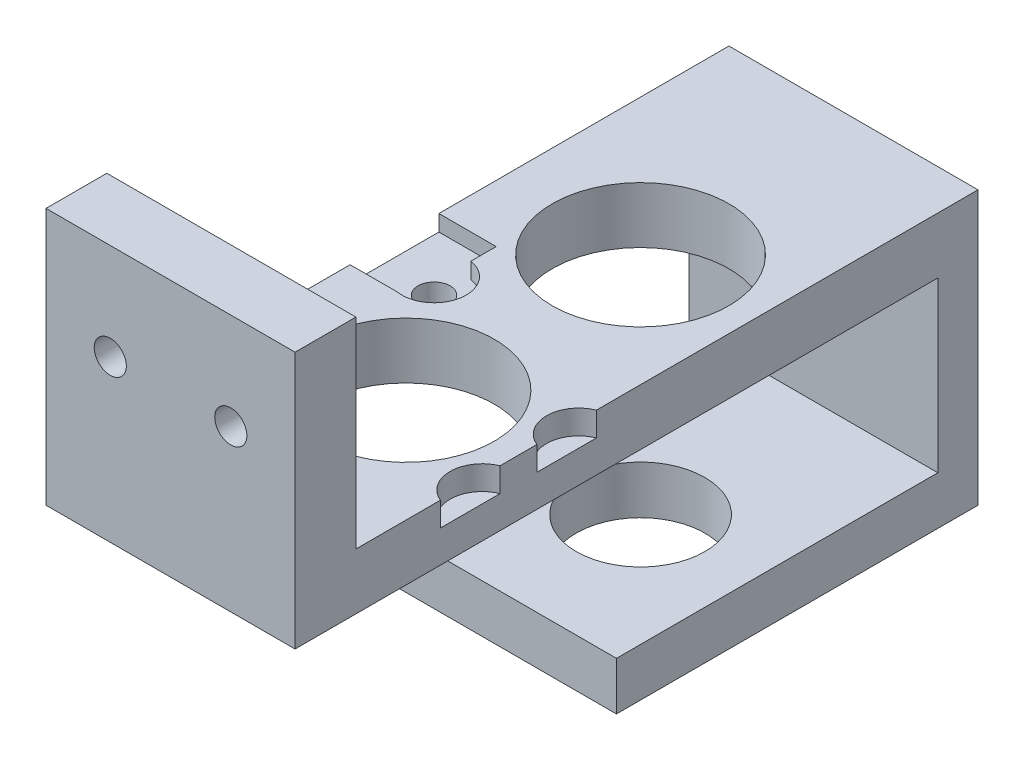
ISO-10303-21;
HEADER;
FILE_DESCRIPTION(('STEP AP214'),'2;1');
FILE_NAME('part.step','',(''),(''),'','','');
FILE_SCHEMA(('AUTOMOTIVE_DESIGN { 1 0 10303 214 1 1 1 1 }'));
ENDSEC;
DATA;
#1=APPLICATION_CONTEXT('core data for automotive mechanical design processes');
#2=APPLICATION_PROTOCOL_DEFINITION('international standard','automotive_design',2000,#1);
#3=PRODUCT_CONTEXT('',#1,'mechanical');
#4=PRODUCT('Part','Part','',(#3));
#5=PRODUCT_RELATED_PRODUCT_CATEGORY('part','',(#4));
#6=PRODUCT_DEFINITION_FORMATION('','',#4);
#7=PRODUCT_DEFINITION_CONTEXT('part definition',#1,'design');
#8=PRODUCT_DEFINITION('design','',#6,#7);
#9=PRODUCT_DEFINITION_SHAPE('','',#8);
#10=(LENGTH_UNIT() NAMED_UNIT(*) SI_UNIT(.MILLI.,.METRE.));
#11=(NAMED_UNIT(*) PLANE_ANGLE_UNIT() SI_UNIT($,.RADIAN.));
#12=(NAMED_UNIT(*) SI_UNIT($,.STERADIAN.) SOLID_ANGLE_UNIT());
#13=UNCERTAINTY_MEASURE_WITH_UNIT(LENGTH_MEASURE(1.E-05),#10,'distance_accuracy_value','');
#14=(GEOMETRIC_REPRESENTATION_CONTEXT(3) GLOBAL_UNCERTAINTY_ASSIGNED_CONTEXT((#13)) GLOBAL_UNIT_ASSIGNED_CONTEXT((#10,
#11,#12)) REPRESENTATION_CONTEXT('',''));
#15=CARTESIAN_POINT('',(0.,0.,0.));
#16=DIRECTION('',(0.,0.,1.));
#17=DIRECTION('',(1.,0.,0.));
#18=AXIS2_PLACEMENT_3D('',#15,#16,#17);
#19=CARTESIAN_POINT('',(-43.661943319838,-7.,42.4348178137652));
#20=DIRECTION('',(0.,1.,0.));
#21=DIRECTION('',(0.,0.,1.));
#22=AXIS2_PLACEMENT_3D('',#19,#20,#21);
#23=CYLINDRICAL_SURFACE('',#22,2.);
#24=CARTESIAN_POINT('',(-43.661943319838,0.,42.4348178137652));
#25=DIRECTION('',(0.,1.,0.));
#26=DIRECTION('',(0.,0.,1.));
#27=AXIS2_PLACEMENT_3D('',#24,#25,#26);
#28=CIRCLE('',#27,2.);
#29=CARTESIAN_POINT('',(-43.661943319838,0.,44.4348178137652));
#30=VERTEX_POINT('',#29);
#31=EDGE_CURVE('E312',#30,#30,#28,.T.);
#32=ORIENTED_EDGE('',*,*,#31,.F.);
#33=EDGE_LOOP('',(#32));
#34=FACE_BOUND('',#33,.T.);
#35=CARTESIAN_POINT('',(-43.661943319838,5.,42.4348178137652));
#36=DIRECTION('',(0.,1.,0.));
#37=DIRECTION('',(0.,0.,1.));
#38=AXIS2_PLACEMENT_3D('',#35,#36,#37);
#39=CIRCLE('',#38,2.);
#40=CARTESIAN_POINT('',(-43.661943319838,5.,44.4348178137652));
#41=VERTEX_POINT('',#40);
#42=EDGE_CURVE('E390',#41,#41,#39,.F.);
#43=ORIENTED_EDGE('',*,*,#42,.F.);
#44=EDGE_LOOP('',(#43));
#45=FACE_BOUND('',#44,.T.);
#46=ADVANCED_FACE('F32',(#34,#45),#23,.F.);
#47=CARTESIAN_POINT('',(-43.661943319838,-7.,14.4348178137652));
#48=DIRECTION('',(0.,1.,0.));
#49=DIRECTION('',(0.,0.,1.));
#50=AXIS2_PLACEMENT_3D('',#47,#48,#49);
#51=CYLINDRICAL_SURFACE('',#50,2.);
#52=CARTESIAN_POINT('',(-43.661943319838,0.,14.4348178137652));
#53=DIRECTION('',(0.,1.,0.));
#54=DIRECTION('',(0.,0.,1.));
#55=AXIS2_PLACEMENT_3D('',#52,#53,#54);
#56=CIRCLE('',#55,2.);
#57=CARTESIAN_POINT('',(-43.661943319838,0.,16.4348178137652));
#58=VERTEX_POINT('',#57);
#59=EDGE_CURVE('E320',#58,#58,#56,.T.);
#60=ORIENTED_EDGE('',*,*,#59,.F.);
#61=EDGE_LOOP('',(#60));
#62=FACE_BOUND('',#61,.T.);
#63=CARTESIAN_POINT('',(-43.661943319838,5.,14.4348178137652));
#64=DIRECTION('',(0.,1.,0.));
#65=DIRECTION('',(0.,0.,1.));
#66=AXIS2_PLACEMENT_3D('',#63,#64,#65);
#67=CIRCLE('',#66,2.);
#68=CARTESIAN_POINT('',(-43.661943319838,5.,16.4348178137652));
#69=VERTEX_POINT('',#68);
#70=EDGE_CURVE('E267',#69,#69,#67,.F.);
#71=ORIENTED_EDGE('',*,*,#70,.F.);
#72=EDGE_LOOP('',(#71));
#73=FACE_BOUND('',#72,.T.);
#74=ADVANCED_FACE('F472',(#62,#73),#51,.F.);
#75=CARTESIAN_POINT('',(-50.161943319838,-27.,-23.7651821862348));
#76=DIRECTION('',(0.,0.,-1.));
#77=DIRECTION('',(-1.,0.,0.));
#78=AXIS2_PLACEMENT_3D('',#75,#76,#77);
#79=PLANE('',#78);
#80=DIRECTION('',(-1.,0.,0.));
#81=VECTOR('',#80,1.);
#82=CARTESIAN_POINT('',(-50.161943319838,-21.,-23.7651821862348));
#83=LINE('',#82,#81);
#84=CARTESIAN_POINT('',(-19.161943319838,-21.,-23.7651821862348));
#85=VERTEX_POINT('',#84);
#86=CARTESIAN_POINT('',(-50.161943319838,-21.,-23.7651821862348));
#87=VERTEX_POINT('',#86);
#88=EDGE_CURVE('E279',#85,#87,#83,.T.);
#89=ORIENTED_EDGE('',*,*,#88,.F.);
#90=DIRECTION('',(0.,1.,0.));
#91=VECTOR('',#90,1.);
#92=CARTESIAN_POINT('',(-19.161943319838,-27.,-23.7651821862348));
#93=LINE('',#92,#91);
#94=CARTESIAN_POINT('',(-19.161943319838,0.,-23.7651821862348));
#95=VERTEX_POINT('',#94);
#96=EDGE_CURVE('E310',#85,#95,#93,.T.);
#97=ORIENTED_EDGE('',*,*,#96,.T.);
#98=DIRECTION('',(-1.,0.,0.));
#99=VECTOR('',#98,1.);
#100=CARTESIAN_POINT('',(-50.161943319838,0.,-23.7651821862348));
#101=LINE('',#100,#99);
#102=CARTESIAN_POINT('',(-50.161943319838,0.,-23.7651821862348));
#103=VERTEX_POINT('',#102);
#104=EDGE_CURVE('E297',#95,#103,#101,.T.);
#105=ORIENTED_EDGE('',*,*,#104,.T.);
#106=DIRECTION('',(0.,1.,0.));
#107=VECTOR('',#106,1.);
#108=CARTESIAN_POINT('',(-50.161943319838,-27.,-23.7651821862348));
#109=LINE('',#108,#107);
#110=EDGE_CURVE('E306',#87,#103,#109,.T.);
#111=ORIENTED_EDGE('',*,*,#110,.F.);
#112=EDGE_LOOP('',(#89,#97,#105,#111));
#113=FACE_BOUND('',#112,.T.);
#114=ADVANCED_FACE('F478',(#113),#79,.F.);
#115=CARTESIAN_POINT('',(0.,0.,0.));
#116=DIRECTION('',(0.,1.,0.));
#117=DIRECTION('',(0.,0.,1.));
#118=AXIS2_PLACEMENT_3D('',#115,#116,#117);
#119=PLANE('',#118);
#120=CARTESIAN_POINT('',(-33.161943319838,0.,-0.765182186234808));
#121=DIRECTION('',(0.,1.,0.));
#122=DIRECTION('',(0.,0.,1.));
#123=AXIS2_PLACEMENT_3D('',#120,#121,#122);
#124=CIRCLE('',#123,11.);
#125=CARTESIAN_POINT('',(-33.161943319838,0.,10.2348178137652));
#126=VERTEX_POINT('',#125);
#127=EDGE_CURVE('E353',#126,#126,#124,.T.);
#128=ORIENTED_EDGE('',*,*,#127,.T.);
#129=EDGE_LOOP('',(#128));
#130=FACE_BOUND('',#129,.T.);
#131=CARTESIAN_POINT('',(-33.161943319838,0.,28.4348178137652));
#132=DIRECTION('',(0.,1.,0.));
#133=DIRECTION('',(0.,0.,1.));
#134=AXIS2_PLACEMENT_3D('',#131,#132,#133);
#135=CIRCLE('',#134,11.);
#136=CARTESIAN_POINT('',(-33.161943319838,0.,39.4348178137652));
#137=VERTEX_POINT('',#136);
#138=EDGE_CURVE('E345',#137,#137,#135,.T.);
#139=ORIENTED_EDGE('',*,*,#138,.T.);
#140=EDGE_LOOP('',(#139));
#141=FACE_BOUND('',#140,.T.);
#142=ORIENTED_EDGE('',*,*,#31,.T.);
#143=EDGE_LOOP('',(#142));
#144=FACE_BOUND('',#143,.T.);
#145=ORIENTED_EDGE('',*,*,#59,.T.);
#146=EDGE_LOOP('',(#145));
#147=FACE_BOUND('',#146,.T.);
#148=ORIENTED_EDGE('',*,*,#104,.F.);
#149=DIRECTION('',(0.,0.,-1.));
#150=VECTOR('',#149,1.);
#151=CARTESIAN_POINT('',(-19.161943319838,0.,-28.7651821862348));
#152=LINE('',#151,#150);
#153=CARTESIAN_POINT('',(-19.161943319838,0.,56.2348178137652));
#154=VERTEX_POINT('',#153);
#155=EDGE_CURVE('E369',#154,#95,#152,.T.);
#156=ORIENTED_EDGE('',*,*,#155,.F.);
#157=DIRECTION('',(1.,0.,0.));
#158=VECTOR('',#157,1.);
#159=CARTESIAN_POINT('',(-50.161943319838,0.,56.2348178137652));
#160=LINE('',#159,#158);
#161=CARTESIAN_POINT('',(-50.161943319838,0.,56.2348178137652));
#162=VERTEX_POINT('',#161);
#163=EDGE_CURVE('E367',#162,#154,#160,.T.);
#164=ORIENTED_EDGE('',*,*,#163,.F.);
#165=DIRECTION('',(0.,0.,1.));
#166=VECTOR('',#165,1.);
#167=CARTESIAN_POINT('',(-50.161943319838,0.,-28.7651821862348));
#168=LINE('',#167,#166);
#169=EDGE_CURVE('E365',#103,#162,#168,.T.);
#170=ORIENTED_EDGE('',*,*,#169,.F.);
#171=EDGE_LOOP('',(#148,#156,#164,#170));
#172=FACE_BOUND('',#171,.T.);
#173=ADVANCED_FACE('F511',(#130,#141,#144,#147,#172),#119,.F.);
#174=CARTESIAN_POINT('',(-50.161943319838,7.,-28.7651821862348));
#175=DIRECTION('',(1.,0.,0.));
#176=DIRECTION('',(0.,0.,-1.));
#177=AXIS2_PLACEMENT_3D('',#174,#175,#176);
#178=PLANE('',#177);
#179=DIRECTION('',(0.,0.,1.));
#180=VECTOR('',#179,1.);
#181=CARTESIAN_POINT('',(-50.161943319838,5.,7.33734720860468));
#182=LINE('',#181,#180);
#183=CARTESIAN_POINT('',(-50.161943319838,5.,7.33734720860468));
#184=VERTEX_POINT('',#183);
#185=CARTESIAN_POINT('',(-50.161943319838,5.,18.3845425666295));
#186=VERTEX_POINT('',#185);
#187=EDGE_CURVE('E219',#184,#186,#182,.T.);
#188=ORIENTED_EDGE('',*,*,#187,.F.);
#189=DIRECTION('',(0.,1.,0.));
#190=VECTOR('',#189,1.);
#191=CARTESIAN_POINT('',(-50.161943319838,5.,7.33734720860468));
#192=LINE('',#191,#190);
#193=CARTESIAN_POINT('',(-50.161943319838,7.,7.33734720860468));
#194=VERTEX_POINT('',#193);
#195=EDGE_CURVE('E239',#184,#194,#192,.T.);
#196=ORIENTED_EDGE('',*,*,#195,.T.);
#197=DIRECTION('',(0.,0.,1.));
#198=VECTOR('',#197,1.);
#199=CARTESIAN_POINT('',(-50.161943319838,7.,-28.7651821862348));
#200=LINE('',#199,#198);
#201=CARTESIAN_POINT('',(-50.161943319838,7.,-28.7651821862348));
#202=VERTEX_POINT('',#201);
#203=EDGE_CURVE('E354',#202,#194,#200,.T.);
#204=ORIENTED_EDGE('',*,*,#203,.F.);
#205=DIRECTION('',(0.,-1.,0.));
#206=VECTOR('',#205,1.);
#207=CARTESIAN_POINT('',(-50.161943319838,7.,-28.7651821862348));
#208=LINE('',#207,#206);
#209=CARTESIAN_POINT('',(-50.161943319838,-27.,-28.7651821862348));
#210=VERTEX_POINT('',#209);
#211=EDGE_CURVE('E364',#202,#210,#208,.T.);
#212=ORIENTED_EDGE('',*,*,#211,.T.);
#213=DIRECTION('',(0.,0.,-1.));
#214=VECTOR('',#213,1.);
#215=CARTESIAN_POINT('',(-50.161943319838,-27.,-28.7651821862348));
#216=LINE('',#215,#214);
#217=CARTESIAN_POINT('',(-50.161943319838,-27.,16.2348178137652));
#218=VERTEX_POINT('',#217);
#219=EDGE_CURVE('E298',#218,#210,#216,.T.);
#220=ORIENTED_EDGE('',*,*,#219,.F.);
#221=DIRECTION('',(0.,-1.,0.));
#222=VECTOR('',#221,1.);
#223=CARTESIAN_POINT('',(-50.161943319838,-27.,16.2348178137652));
#224=LINE('',#223,#222);
#225=CARTESIAN_POINT('',(-50.161943319838,-21.,16.2348178137652));
#226=VERTEX_POINT('',#225);
#227=EDGE_CURVE('E281',#226,#218,#224,.T.);
#228=ORIENTED_EDGE('',*,*,#227,.F.);
#229=DIRECTION('',(0.,0.,-1.));
#230=VECTOR('',#229,1.);
#231=CARTESIAN_POINT('',(-50.161943319838,-21.,16.2348178137652));
#232=LINE('',#231,#230);
#233=EDGE_CURVE('E291',#226,#87,#232,.T.);
#234=ORIENTED_EDGE('',*,*,#233,.T.);
#235=ORIENTED_EDGE('',*,*,#110,.T.);
#236=ORIENTED_EDGE('',*,*,#169,.T.);
#237=DIRECTION('',(0.,-1.,0.));
#238=VECTOR('',#237,1.);
#239=CARTESIAN_POINT('',(-50.161943319838,7.,56.2348178137652));
#240=LINE('',#239,#238);
#241=CARTESIAN_POINT('',(-50.161943319838,32.,56.2348178137652));
#242=VERTEX_POINT('',#241);
#243=EDGE_CURVE('E378',#242,#162,#240,.T.);
#244=ORIENTED_EDGE('',*,*,#243,.F.);
#245=DIRECTION('',(0.,0.,1.));
#246=VECTOR('',#245,1.);
#247=CARTESIAN_POINT('',(-50.161943319838,32.,56.2348178137652));
#248=LINE('',#247,#246);
#249=CARTESIAN_POINT('',(-50.161943319838,32.,48.6648178137652));
#250=VERTEX_POINT('',#249);
#251=EDGE_CURVE('E327',#250,#242,#248,.T.);
#252=ORIENTED_EDGE('',*,*,#251,.F.);
#253=DIRECTION('',(0.,-1.,0.));
#254=VECTOR('',#253,1.);
#255=CARTESIAN_POINT('',(-50.161943319838,32.,48.6648178137652));
#256=LINE('',#255,#254);
#257=CARTESIAN_POINT('',(-50.161943319838,5.,48.6648178137652));
#258=VERTEX_POINT('',#257);
#259=EDGE_CURVE('E337',#250,#258,#256,.T.);
#260=ORIENTED_EDGE('',*,*,#259,.T.);
#261=DIRECTION('',(0.,0.,1.));
#262=VECTOR('',#261,1.);
#263=CARTESIAN_POINT('',(-50.161943319838,5.,39.3079647830632));
#264=LINE('',#263,#262);
#265=CARTESIAN_POINT('',(-50.161943319838,5.,39.3079647830632));
#266=VERTEX_POINT('',#265);
#267=EDGE_CURVE('E247',#266,#258,#264,.T.);
#268=ORIENTED_EDGE('',*,*,#267,.F.);
#269=DIRECTION('',(0.,1.,0.));
#270=VECTOR('',#269,1.);
#271=CARTESIAN_POINT('',(-50.161943319838,5.,39.3079647830632));
#272=LINE('',#271,#270);
#273=CARTESIAN_POINT('',(-50.161943319838,7.,39.3079647830632));
#274=VERTEX_POINT('',#273);
#275=EDGE_CURVE('E236',#266,#274,#272,.T.);
#276=ORIENTED_EDGE('',*,*,#275,.T.);
#277=CARTESIAN_POINT('',(-50.161943319838,7.,18.3845425666295));
#278=VERTEX_POINT('',#277);
#279=EDGE_CURVE('E357',#278,#274,#200,.T.);
#280=ORIENTED_EDGE('',*,*,#279,.F.);
#281=DIRECTION('',(0.,1.,0.));
#282=VECTOR('',#281,1.);
#283=CARTESIAN_POINT('',(-50.161943319838,5.,18.3845425666295));
#284=LINE('',#283,#282);
#285=EDGE_CURVE('E231',#186,#278,#284,.T.);
#286=ORIENTED_EDGE('',*,*,#285,.F.);
#287=EDGE_LOOP('',(#188,#196,#204,#212,#220,#228,#234,#235,#236,#244,#252,#260,#268,#276,#280,#286));
#288=FACE_BOUND('',#287,.T.);
#289=ADVANCED_FACE('F34',(#288),#178,.F.);
#290=CARTESIAN_POINT('',(-50.161943319838,7.,56.2348178137652));
#291=DIRECTION('',(0.,0.,-1.));
#292=DIRECTION('',(-1.,0.,0.));
#293=AXIS2_PLACEMENT_3D('',#290,#291,#292);
#294=PLANE('',#293);
#295=CARTESIAN_POINT('',(-42.161943319838,20.,56.2348178137652));
#296=DIRECTION('',(0.,0.,-1.));
#297=DIRECTION('',(-1.,0.,0.));
#298=AXIS2_PLACEMENT_3D('',#295,#296,#297);
#299=CIRCLE('',#298,2.);
#300=CARTESIAN_POINT('',(-44.161943319838,20.,56.2348178137652));
#301=VERTEX_POINT('',#300);
#302=EDGE_CURVE('E323',#301,#301,#299,.T.);
#303=ORIENTED_EDGE('',*,*,#302,.T.);
#304=EDGE_LOOP('',(#303));
#305=FACE_BOUND('',#304,.T.);
#306=CARTESIAN_POINT('',(-27.161943319838,20.,56.2348178137652));
#307=DIRECTION('',(0.,0.,-1.));
#308=DIRECTION('',(-1.,0.,0.));
#309=AXIS2_PLACEMENT_3D('',#306,#307,#308);
#310=CIRCLE('',#309,2.);
#311=CARTESIAN_POINT('',(-29.161943319838,20.,56.2348178137652));
#312=VERTEX_POINT('',#311);
#313=EDGE_CURVE('E316',#312,#312,#310,.T.);
#314=ORIENTED_EDGE('',*,*,#313,.T.);
#315=EDGE_LOOP('',(#314));
#316=FACE_BOUND('',#315,.T.);
#317=ORIENTED_EDGE('',*,*,#163,.T.);
#318=DIRECTION('',(0.,-1.,0.));
#319=VECTOR('',#318,1.);
#320=CARTESIAN_POINT('',(-19.161943319838,7.,56.2348178137652));
#321=LINE('',#320,#319);
#322=CARTESIAN_POINT('',(-19.161943319838,32.,56.2348178137652));
#323=VERTEX_POINT('',#322);
#324=EDGE_CURVE('E375',#323,#154,#321,.T.);
#325=ORIENTED_EDGE('',*,*,#324,.F.);
#326=DIRECTION('',(1.,0.,0.));
#327=VECTOR('',#326,1.);
#328=CARTESIAN_POINT('',(-50.161943319838,32.,56.2348178137652));
#329=LINE('',#328,#327);
#330=EDGE_CURVE('E330',#242,#323,#329,.T.);
#331=ORIENTED_EDGE('',*,*,#330,.F.);
#332=ORIENTED_EDGE('',*,*,#243,.T.);
#333=EDGE_LOOP('',(#317,#325,#331,#332));
#334=FACE_BOUND('',#333,.T.);
#335=ADVANCED_FACE('F518',(#305,#316,#334),#294,.F.);
#336=CARTESIAN_POINT('',(-19.161943319838,7.,-28.7651821862348));
#337=DIRECTION('',(-1.,0.,0.));
#338=DIRECTION('',(0.,0.,1.));
#339=AXIS2_PLACEMENT_3D('',#336,#337,#338);
#340=PLANE('',#339);
#341=DIRECTION('',(0.,0.,-1.));
#342=VECTOR('',#341,1.);
#343=CARTESIAN_POINT('',(-19.161943319838,4.,0.));
#344=LINE('',#343,#342);
#345=CARTESIAN_POINT('',(-19.161943319838,4.,26.142917057313));
#346=VERTEX_POINT('',#345);
#347=CARTESIAN_POINT('',(-19.161943319838,4.,18.7267185702174));
#348=VERTEX_POINT('',#347);
#349=EDGE_CURVE('E189',#346,#348,#344,.T.);
#350=ORIENTED_EDGE('',*,*,#349,.F.);
#351=DIRECTION('',(0.,1.,0.));
#352=VECTOR('',#351,1.);
#353=CARTESIAN_POINT('',(-19.161943319838,4.,26.142917057313));
#354=LINE('',#353,#352);
#355=CARTESIAN_POINT('',(-19.161943319838,7.,26.142917057313));
#356=VERTEX_POINT('',#355);
#357=EDGE_CURVE('E197',#346,#356,#354,.T.);
#358=ORIENTED_EDGE('',*,*,#357,.T.);
#359=DIRECTION('',(0.,0.,-1.));
#360=VECTOR('',#359,1.);
#361=CARTESIAN_POINT('',(-19.161943319838,7.,-28.7651821862348));
#362=LINE('',#361,#360);
#363=CARTESIAN_POINT('',(-19.161943319838,7.,30.7267185702174));
#364=VERTEX_POINT('',#363);
#365=EDGE_CURVE('E362',#364,#356,#362,.T.);
#366=ORIENTED_EDGE('',*,*,#365,.F.);
#367=DIRECTION('',(0.,1.,0.));
#368=VECTOR('',#367,1.);
#369=CARTESIAN_POINT('',(-19.161943319838,4.,30.7267185702174));
#370=LINE('',#369,#368);
#371=CARTESIAN_POINT('',(-19.161943319838,4.,30.7267185702174));
#372=VERTEX_POINT('',#371);
#373=EDGE_CURVE('E55',#372,#364,#370,.T.);
#374=ORIENTED_EDGE('',*,*,#373,.F.);
#375=DIRECTION('',(0.,0.,-1.));
#376=VECTOR('',#375,1.);
#377=CARTESIAN_POINT('',(-19.161943319838,4.,0.));
#378=LINE('',#377,#376);
#379=CARTESIAN_POINT('',(-19.161943319838,4.,38.142917057313));
#380=VERTEX_POINT('',#379);
#381=EDGE_CURVE('E208',#380,#372,#378,.T.);
#382=ORIENTED_EDGE('',*,*,#381,.F.);
#383=DIRECTION('',(0.,1.,0.));
#384=VECTOR('',#383,1.);
#385=CARTESIAN_POINT('',(-19.161943319838,4.,38.142917057313));
#386=LINE('',#385,#384);
#387=CARTESIAN_POINT('',(-19.161943319838,7.,38.142917057313));
#388=VERTEX_POINT('',#387);
#389=EDGE_CURVE('E215',#380,#388,#386,.T.);
#390=ORIENTED_EDGE('',*,*,#389,.T.);
#391=CARTESIAN_POINT('',(-19.161943319838,7.,48.6648178137652));
#392=VERTEX_POINT('',#391);
#393=EDGE_CURVE('E358',#392,#388,#362,.T.);
#394=ORIENTED_EDGE('',*,*,#393,.F.);
#395=DIRECTION('',(0.,-1.,0.));
#396=VECTOR('',#395,1.);
#397=CARTESIAN_POINT('',(-19.161943319838,32.,48.6648178137652));
#398=LINE('',#397,#396);
#399=CARTESIAN_POINT('',(-19.161943319838,32.,48.6648178137652));
#400=VERTEX_POINT('',#399);
#401=EDGE_CURVE('E341',#400,#392,#398,.T.);
#402=ORIENTED_EDGE('',*,*,#401,.F.);
#403=DIRECTION('',(0.,0.,-1.));
#404=VECTOR('',#403,1.);
#405=CARTESIAN_POINT('',(-19.161943319838,32.,56.2348178137652));
#406=LINE('',#405,#404);
#407=EDGE_CURVE('E333',#323,#400,#406,.T.);
#408=ORIENTED_EDGE('',*,*,#407,.F.);
#409=ORIENTED_EDGE('',*,*,#324,.T.);
#410=ORIENTED_EDGE('',*,*,#155,.T.);
#411=ORIENTED_EDGE('',*,*,#96,.F.);
#412=DIRECTION('',(0.,0.,-1.));
#413=VECTOR('',#412,1.);
#414=CARTESIAN_POINT('',(-19.161943319838,-21.,16.2348178137652));
#415=LINE('',#414,#413);
#416=CARTESIAN_POINT('',(-19.161943319838,-21.,16.2348178137652));
#417=VERTEX_POINT('',#416);
#418=EDGE_CURVE('E295',#417,#85,#415,.T.);
#419=ORIENTED_EDGE('',*,*,#418,.F.);
#420=DIRECTION('',(0.,1.,0.));
#421=VECTOR('',#420,1.);
#422=CARTESIAN_POINT('',(-19.161943319838,-27.,16.2348178137652));
#423=LINE('',#422,#421);
#424=CARTESIAN_POINT('',(-19.161943319838,-27.,16.2348178137652));
#425=VERTEX_POINT('',#424);
#426=EDGE_CURVE('E287',#425,#417,#423,.T.);
#427=ORIENTED_EDGE('',*,*,#426,.F.);
#428=DIRECTION('',(0.,0.,1.));
#429=VECTOR('',#428,1.);
#430=CARTESIAN_POINT('',(-19.161943319838,-27.,-28.7651821862348));
#431=LINE('',#430,#429);
#432=CARTESIAN_POINT('',(-19.161943319838,-27.,-28.7651821862348));
#433=VERTEX_POINT('',#432);
#434=EDGE_CURVE('E304',#433,#425,#431,.T.);
#435=ORIENTED_EDGE('',*,*,#434,.F.);
#436=DIRECTION('',(0.,-1.,0.));
#437=VECTOR('',#436,1.);
#438=CARTESIAN_POINT('',(-19.161943319838,7.,-28.7651821862348));
#439=LINE('',#438,#437);
#440=CARTESIAN_POINT('',(-19.161943319838,7.,-28.7651821862348));
#441=VERTEX_POINT('',#440);
#442=EDGE_CURVE('E373',#441,#433,#439,.T.);
#443=ORIENTED_EDGE('',*,*,#442,.F.);
#444=CARTESIAN_POINT('',(-19.161943319838,7.,18.7267185702174));
#445=VERTEX_POINT('',#444);
#446=EDGE_CURVE('E202',#445,#441,#362,.T.);
#447=ORIENTED_EDGE('',*,*,#446,.F.);
#448=DIRECTION('',(0.,1.,0.));
#449=VECTOR('',#448,1.);
#450=CARTESIAN_POINT('',(-19.161943319838,4.,18.7267185702174));
#451=LINE('',#450,#449);
#452=EDGE_CURVE('E47',#348,#445,#451,.T.);
#453=ORIENTED_EDGE('',*,*,#452,.F.);
#454=EDGE_LOOP('',(#350,#358,#366,#374,#382,#390,#394,#402,#408,#409,#410,#411,#419,#427,#435,
#443,#447,#453));
#455=FACE_BOUND('',#454,.T.);
#456=ADVANCED_FACE('F200',(#455),#340,.F.);
#457=CARTESIAN_POINT('',(-50.161943319838,7.,-28.7651821862348));
#458=DIRECTION('',(0.,0.,1.));
#459=DIRECTION('',(1.,0.,0.));
#460=AXIS2_PLACEMENT_3D('',#457,#458,#459);
#461=PLANE('',#460);
#462=ORIENTED_EDGE('',*,*,#442,.T.);
#463=DIRECTION('',(1.,0.,0.));
#464=VECTOR('',#463,1.);
#465=CARTESIAN_POINT('',(-50.161943319838,-27.,-28.7651821862348));
#466=LINE('',#465,#464);
#467=EDGE_CURVE('E301',#210,#433,#466,.T.);
#468=ORIENTED_EDGE('',*,*,#467,.F.);
#469=ORIENTED_EDGE('',*,*,#211,.F.);
#470=DIRECTION('',(-1.,0.,0.));
#471=VECTOR('',#470,1.);
#472=CARTESIAN_POINT('',(-50.161943319838,7.,-28.7651821862348));
#473=LINE('',#472,#471);
#474=EDGE_CURVE('E361',#441,#202,#473,.T.);
#475=ORIENTED_EDGE('',*,*,#474,.F.);
#476=EDGE_LOOP('',(#462,#468,#469,#475));
#477=FACE_BOUND('',#476,.T.);
#478=ADVANCED_FACE('F446',(#477),#461,.F.);
#479=CARTESIAN_POINT('',(0.,7.,0.));
#480=DIRECTION('',(0.,1.,0.));
#481=DIRECTION('',(0.,0.,1.));
#482=AXIS2_PLACEMENT_3D('',#479,#480,#481);
#483=PLANE('',#482);
#484=CARTESIAN_POINT('',(-17.661943319838,7.,22.4348178137652));
#485=DIRECTION('',(0.,1.,0.));
#486=DIRECTION('',(0.,0.,1.));
#487=AXIS2_PLACEMENT_3D('',#484,#485,#486);
#488=CIRCLE('',#487,4.);
#489=EDGE_CURVE('E194',#445,#356,#488,.T.);
#490=ORIENTED_EDGE('',*,*,#489,.F.);
#491=ORIENTED_EDGE('',*,*,#446,.T.);
#492=ORIENTED_EDGE('',*,*,#474,.T.);
#493=ORIENTED_EDGE('',*,*,#203,.T.);
#494=DIRECTION('',(-1.,0.,0.));
#495=VECTOR('',#494,1.);
#496=CARTESIAN_POINT('',(-50.161943319838,7.,7.33734720860468));
#497=LINE('',#496,#495);
#498=CARTESIAN_POINT('',(-43.0297452681085,7.,7.33734720860468));
#499=VERTEX_POINT('',#498);
#500=EDGE_CURVE('E223',#499,#194,#497,.T.);
#501=ORIENTED_EDGE('',*,*,#500,.F.);
#502=DIRECTION('',(0.,0.,-1.));
#503=VECTOR('',#502,1.);
#504=CARTESIAN_POINT('',(-43.0297452681085,7.,7.33734720860468));
#505=LINE('',#504,#503);
#506=CARTESIAN_POINT('',(-43.0297452681085,7.,10.4850930609008));
#507=VERTEX_POINT('',#506);
#508=EDGE_CURVE('E235',#507,#499,#505,.T.);
#509=ORIENTED_EDGE('',*,*,#508,.F.);
#510=CARTESIAN_POINT('',(-43.661943319838,7.,14.4348178137652));
#511=DIRECTION('',(0.,1.,0.));
#512=DIRECTION('',(0.,0.,1.));
#513=AXIS2_PLACEMENT_3D('',#510,#511,#512);
#514=CIRCLE('',#513,4.00000000000001);
#515=CARTESIAN_POINT('',(-44.2941413715676,7.,18.3845425666295));
#516=VERTEX_POINT('',#515);
#517=EDGE_CURVE('E268',#516,#507,#514,.T.);
#518=ORIENTED_EDGE('',*,*,#517,.F.);
#519=DIRECTION('',(1.,0.,0.));
#520=VECTOR('',#519,1.);
#521=CARTESIAN_POINT('',(-50.161943319838,7.,18.3845425666295));
#522=LINE('',#521,#520);
#523=EDGE_CURVE('E232',#278,#516,#522,.T.);
#524=ORIENTED_EDGE('',*,*,#523,.F.);
#525=ORIENTED_EDGE('',*,*,#279,.T.);
#526=DIRECTION('',(-1.,0.,0.));
#527=VECTOR('',#526,1.);
#528=CARTESIAN_POINT('',(-50.161943319838,7.,39.3079647830632));
#529=LINE('',#528,#527);
#530=CARTESIAN_POINT('',(-46.156495408769,7.,39.3079647830632));
#531=VERTEX_POINT('',#530);
#532=EDGE_CURVE('E251',#531,#274,#529,.T.);
#533=ORIENTED_EDGE('',*,*,#532,.F.);
#534=CARTESIAN_POINT('',(-43.661943319838,7.,42.4348178137652));
#535=DIRECTION('',(0.,1.,0.));
#536=DIRECTION('',(0.,0.,1.));
#537=AXIS2_PLACEMENT_3D('',#534,#535,#536);
#538=CIRCLE('',#537,4.);
#539=CARTESIAN_POINT('',(-42.4266919921266,7.,46.239309127645));
#540=VERTEX_POINT('',#539);
#541=EDGE_CURVE('E242',#540,#531,#538,.T.);
#542=ORIENTED_EDGE('',*,*,#541,.F.);
#543=DIRECTION('',(0.,0.,-1.));
#544=VECTOR('',#543,1.);
#545=CARTESIAN_POINT('',(-42.4266919921266,7.,39.3079647830632));
#546=LINE('',#545,#544);
#547=CARTESIAN_POINT('',(-42.4266919921266,7.,48.6648178137652));
#548=VERTEX_POINT('',#547);
#549=EDGE_CURVE('E204',#548,#540,#546,.T.);
#550=ORIENTED_EDGE('',*,*,#549,.F.);
#551=DIRECTION('',(-1.,0.,0.));
#552=VECTOR('',#551,1.);
#553=CARTESIAN_POINT('',(-50.161943319838,7.,48.6648178137652));
#554=LINE('',#553,#552);
#555=EDGE_CURVE('E326',#392,#548,#554,.T.);
#556=ORIENTED_EDGE('',*,*,#555,.F.);
#557=ORIENTED_EDGE('',*,*,#393,.T.);
#558=CARTESIAN_POINT('',(-17.661943319838,7.,34.4348178137652));
#559=DIRECTION('',(0.,1.,0.));
#560=DIRECTION('',(0.,0.,1.));
#561=AXIS2_PLACEMENT_3D('',#558,#559,#560);
#562=CIRCLE('',#561,4.);
#563=EDGE_CURVE('E211',#364,#388,#562,.T.);
#564=ORIENTED_EDGE('',*,*,#563,.F.);
#565=ORIENTED_EDGE('',*,*,#365,.T.);
#566=EDGE_LOOP('',(#490,#491,#492,#493,#501,#509,#518,#524,#525,#533,#542,#550,#556,#557,#564,#565));
#567=FACE_BOUND('',#566,.T.);
#568=CARTESIAN_POINT('',(-33.161943319838,7.,28.4348178137652));
#569=DIRECTION('',(0.,1.,0.));
#570=DIRECTION('',(0.,0.,1.));
#571=AXIS2_PLACEMENT_3D('',#568,#569,#570);
#572=CIRCLE('',#571,11.);
#573=CARTESIAN_POINT('',(-33.161943319838,7.,39.4348178137652));
#574=VERTEX_POINT('',#573);
#575=EDGE_CURVE('E344',#574,#574,#572,.T.);
#576=ORIENTED_EDGE('',*,*,#575,.F.);
#577=EDGE_LOOP('',(#576));
#578=FACE_BOUND('',#577,.T.);
#579=CARTESIAN_POINT('',(-33.161943319838,7.,-0.765182186234808));
#580=DIRECTION('',(0.,1.,0.));
#581=DIRECTION('',(0.,0.,1.));
#582=AXIS2_PLACEMENT_3D('',#579,#580,#581);
#583=CIRCLE('',#582,11.);
#584=CARTESIAN_POINT('',(-33.161943319838,7.,10.2348178137652));
#585=VERTEX_POINT('',#584);
#586=EDGE_CURVE('E348',#585,#585,#583,.T.);
#587=ORIENTED_EDGE('',*,*,#586,.F.);
#588=EDGE_LOOP('',(#587));
#589=FACE_BOUND('',#588,.T.);
#590=ADVANCED_FACE('F410',(#567,#578,#589),#483,.T.);
#591=CARTESIAN_POINT('',(-33.161943319838,-93.,-0.765182186234808));
#592=DIRECTION('',(0.,1.,0.));
#593=DIRECTION('',(0.,0.,1.));
#594=AXIS2_PLACEMENT_3D('',#591,#592,#593);
#595=CYLINDRICAL_SURFACE('',#594,11.);
#596=ORIENTED_EDGE('',*,*,#586,.T.);
#597=EDGE_LOOP('',(#596));
#598=FACE_BOUND('',#597,.T.);
#599=ORIENTED_EDGE('',*,*,#127,.F.);
#600=EDGE_LOOP('',(#599));
#601=FACE_BOUND('',#600,.T.);
#602=ADVANCED_FACE('F504',(#598,#601),#595,.F.);
#603=CARTESIAN_POINT('',(-33.161943319838,0.,28.4348178137652));
#604=DIRECTION('',(0.,1.,0.));
#605=DIRECTION('',(0.,0.,1.));
#606=AXIS2_PLACEMENT_3D('',#603,#604,#605);
#607=CYLINDRICAL_SURFACE('',#606,11.);
#608=ORIENTED_EDGE('',*,*,#138,.F.);
#609=EDGE_LOOP('',(#608));
#610=FACE_BOUND('',#609,.T.);
#611=ORIENTED_EDGE('',*,*,#575,.T.);
#612=EDGE_LOOP('',(#611));
#613=FACE_BOUND('',#612,.T.);
#614=ADVANCED_FACE('F500',(#610,#613),#607,.F.);
#615=CARTESIAN_POINT('',(-50.161943319838,32.,48.6648178137652));
#616=DIRECTION('',(0.,0.,1.));
#617=DIRECTION('',(1.,0.,0.));
#618=AXIS2_PLACEMENT_3D('',#615,#616,#617);
#619=PLANE('',#618);
#620=CARTESIAN_POINT('',(-42.161943319838,20.,48.6648178137652));
#621=DIRECTION('',(0.,0.,-1.));
#622=DIRECTION('',(-1.,0.,0.));
#623=AXIS2_PLACEMENT_3D('',#620,#621,#622);
#624=CIRCLE('',#623,2.);
#625=CARTESIAN_POINT('',(-44.161943319838,20.,48.6648178137652));
#626=VERTEX_POINT('',#625);
#627=EDGE_CURVE('E313',#626,#626,#624,.T.);
#628=ORIENTED_EDGE('',*,*,#627,.F.);
#629=EDGE_LOOP('',(#628));
#630=FACE_BOUND('',#629,.T.);
#631=CARTESIAN_POINT('',(-27.161943319838,20.,48.6648178137652));
#632=DIRECTION('',(0.,0.,-1.));
#633=DIRECTION('',(-1.,0.,0.));
#634=AXIS2_PLACEMENT_3D('',#631,#632,#633);
#635=CIRCLE('',#634,2.);
#636=CARTESIAN_POINT('',(-29.161943319838,20.,48.6648178137652));
#637=VERTEX_POINT('',#636);
#638=EDGE_CURVE('E317',#637,#637,#635,.T.);
#639=ORIENTED_EDGE('',*,*,#638,.F.);
#640=EDGE_LOOP('',(#639));
#641=FACE_BOUND('',#640,.T.);
#642=ORIENTED_EDGE('',*,*,#555,.T.);
#643=DIRECTION('',(0.,1.,0.));
#644=VECTOR('',#643,1.);
#645=CARTESIAN_POINT('',(-42.4266919921266,5.,48.6648178137652));
#646=LINE('',#645,#644);
#647=CARTESIAN_POINT('',(-42.4266919921266,5.,48.6648178137652));
#648=VERTEX_POINT('',#647);
#649=EDGE_CURVE('E258',#648,#548,#646,.T.);
#650=ORIENTED_EDGE('',*,*,#649,.F.);
#651=DIRECTION('',(1.,0.,0.));
#652=VECTOR('',#651,1.);
#653=CARTESIAN_POINT('',(-50.161943319838,5.,48.6648178137652));
#654=LINE('',#653,#652);
#655=EDGE_CURVE('E250',#258,#648,#654,.T.);
#656=ORIENTED_EDGE('',*,*,#655,.F.);
#657=ORIENTED_EDGE('',*,*,#259,.F.);
#658=DIRECTION('',(-1.,0.,0.));
#659=VECTOR('',#658,1.);
#660=CARTESIAN_POINT('',(-50.161943319838,32.,48.6648178137652));
#661=LINE('',#660,#659);
#662=EDGE_CURVE('E335',#400,#250,#661,.T.);
#663=ORIENTED_EDGE('',*,*,#662,.F.);
#664=ORIENTED_EDGE('',*,*,#401,.T.);
#665=EDGE_LOOP('',(#642,#650,#656,#657,#663,#664));
#666=FACE_BOUND('',#665,.T.);
#667=ADVANCED_FACE('F431',(#630,#641,#666),#619,.F.);
#668=CARTESIAN_POINT('',(0.,32.,0.));
#669=DIRECTION('',(0.,-1.,0.));
#670=DIRECTION('',(0.,0.,-1.));
#671=AXIS2_PLACEMENT_3D('',#668,#669,#670);
#672=PLANE('',#671);
#673=ORIENTED_EDGE('',*,*,#251,.T.);
#674=ORIENTED_EDGE('',*,*,#330,.T.);
#675=ORIENTED_EDGE('',*,*,#407,.T.);
#676=ORIENTED_EDGE('',*,*,#662,.T.);
#677=EDGE_LOOP('',(#673,#674,#675,#676));
#678=FACE_BOUND('',#677,.T.);
#679=ADVANCED_FACE('F493',(#678),#672,.F.);
#680=CARTESIAN_POINT('',(-27.161943319838,20.,62.6648178137652));
#681=DIRECTION('',(0.,0.,-1.));
#682=DIRECTION('',(-1.,0.,0.));
#683=AXIS2_PLACEMENT_3D('',#680,#681,#682);
#684=CYLINDRICAL_SURFACE('',#683,2.);
#685=ORIENTED_EDGE('',*,*,#638,.T.);
#686=EDGE_LOOP('',(#685));
#687=FACE_BOUND('',#686,.T.);
#688=ORIENTED_EDGE('',*,*,#313,.F.);
#689=EDGE_LOOP('',(#688));
#690=FACE_BOUND('',#689,.T.);
#691=ADVANCED_FACE('F489',(#687,#690),#684,.F.);
#692=CARTESIAN_POINT('',(-42.161943319838,20.,62.6648178137652));
#693=DIRECTION('',(0.,0.,-1.));
#694=DIRECTION('',(-1.,0.,0.));
#695=AXIS2_PLACEMENT_3D('',#692,#693,#694);
#696=CYLINDRICAL_SURFACE('',#695,2.);
#697=ORIENTED_EDGE('',*,*,#627,.T.);
#698=EDGE_LOOP('',(#697));
#699=FACE_BOUND('',#698,.T.);
#700=ORIENTED_EDGE('',*,*,#302,.F.);
#701=EDGE_LOOP('',(#700));
#702=FACE_BOUND('',#701,.T.);
#703=ADVANCED_FACE('F485',(#699,#702),#696,.F.);
#704=CARTESIAN_POINT('',(0.,-27.,0.));
#705=DIRECTION('',(0.,1.,0.));
#706=DIRECTION('',(0.,0.,1.));
#707=AXIS2_PLACEMENT_3D('',#704,#705,#706);
#708=PLANE('',#707);
#709=CARTESIAN_POINT('',(-33.161943319838,-27.,-0.765182186234808));
#710=DIRECTION('',(0.,1.,0.));
#711=DIRECTION('',(0.,0.,1.));
#712=AXIS2_PLACEMENT_3D('',#709,#710,#711);
#713=CIRCLE('',#712,8.);
#714=CARTESIAN_POINT('',(-33.161943319838,-27.,7.23481781376519));
#715=VERTEX_POINT('',#714);
#716=EDGE_CURVE('E276',#715,#715,#713,.T.);
#717=ORIENTED_EDGE('',*,*,#716,.T.);
#718=EDGE_LOOP('',(#717));
#719=FACE_BOUND('',#718,.T.);
#720=ORIENTED_EDGE('',*,*,#219,.T.);
#721=ORIENTED_EDGE('',*,*,#467,.T.);
#722=ORIENTED_EDGE('',*,*,#434,.T.);
#723=DIRECTION('',(1.,0.,0.));
#724=VECTOR('',#723,1.);
#725=CARTESIAN_POINT('',(-50.161943319838,-27.,16.2348178137652));
#726=LINE('',#725,#724);
#727=EDGE_CURVE('E284',#218,#425,#726,.T.);
#728=ORIENTED_EDGE('',*,*,#727,.F.);
#729=EDGE_LOOP('',(#720,#721,#722,#728));
#730=FACE_BOUND('',#729,.T.);
#731=ADVANCED_FACE('F488',(#719,#730),#708,.F.);
#732=CARTESIAN_POINT('',(-50.161943319838,-21.,16.2348178137652));
#733=DIRECTION('',(0.,-1.,0.));
#734=DIRECTION('',(0.,0.,-1.));
#735=AXIS2_PLACEMENT_3D('',#732,#733,#734);
#736=PLANE('',#735);
#737=CARTESIAN_POINT('',(-33.161943319838,-21.,-0.765182186234808));
#738=DIRECTION('',(0.,-1.,0.));
#739=DIRECTION('',(0.,0.,-1.));
#740=AXIS2_PLACEMENT_3D('',#737,#738,#739);
#741=CIRCLE('',#740,8.);
#742=CARTESIAN_POINT('',(-33.161943319838,-21.,-8.76518218623481));
#743=VERTEX_POINT('',#742);
#744=EDGE_CURVE('E280',#743,#743,#741,.T.);
#745=ORIENTED_EDGE('',*,*,#744,.T.);
#746=EDGE_LOOP('',(#745));
#747=FACE_BOUND('',#746,.T.);
#748=ORIENTED_EDGE('',*,*,#88,.T.);
#749=ORIENTED_EDGE('',*,*,#233,.F.);
#750=DIRECTION('',(-1.,0.,0.));
#751=VECTOR('',#750,1.);
#752=CARTESIAN_POINT('',(-50.161943319838,-21.,16.2348178137652));
#753=LINE('',#752,#751);
#754=EDGE_CURVE('E289',#417,#226,#753,.T.);
#755=ORIENTED_EDGE('',*,*,#754,.F.);
#756=ORIENTED_EDGE('',*,*,#418,.T.);
#757=EDGE_LOOP('',(#748,#749,#755,#756));
#758=FACE_BOUND('',#757,.T.);
#759=ADVANCED_FACE('F542',(#747,#758),#736,.F.);
#760=CARTESIAN_POINT('',(0.,0.,16.2348178137652));
#761=DIRECTION('',(0.,0.,-1.));
#762=DIRECTION('',(-1.,0.,0.));
#763=AXIS2_PLACEMENT_3D('',#760,#761,#762);
#764=PLANE('',#763);
#765=ORIENTED_EDGE('',*,*,#227,.T.);
#766=ORIENTED_EDGE('',*,*,#727,.T.);
#767=ORIENTED_EDGE('',*,*,#426,.T.);
#768=ORIENTED_EDGE('',*,*,#754,.T.);
#769=EDGE_LOOP('',(#765,#766,#767,#768));
#770=FACE_BOUND('',#769,.T.);
#771=ADVANCED_FACE('F467',(#770),#764,.F.);
#772=CARTESIAN_POINT('',(-33.161943319838,-33.,-0.765182186234808));
#773=DIRECTION('',(0.,1.,0.));
#774=DIRECTION('',(0.,0.,1.));
#775=AXIS2_PLACEMENT_3D('',#772,#773,#774);
#776=CYLINDRICAL_SURFACE('',#775,8.);
#777=ORIENTED_EDGE('',*,*,#744,.F.);
#778=EDGE_LOOP('',(#777));
#779=FACE_BOUND('',#778,.T.);
#780=ORIENTED_EDGE('',*,*,#716,.F.);
#781=EDGE_LOOP('',(#780));
#782=FACE_BOUND('',#781,.T.);
#783=ADVANCED_FACE('F458',(#779,#782),#776,.F.);
#784=CARTESIAN_POINT('',(-43.661943319838,5.,14.4348178137652));
#785=DIRECTION('',(0.,1.,0.));
#786=DIRECTION('',(0.,0.,1.));
#787=AXIS2_PLACEMENT_3D('',#784,#785,#786);
#788=PLANE('',#787);
#789=ORIENTED_EDGE('',*,*,#70,.T.);
#790=EDGE_LOOP('',(#789));
#791=FACE_BOUND('',#790,.T.);
#792=DIRECTION('',(1.,0.,0.));
#793=VECTOR('',#792,1.);
#794=CARTESIAN_POINT('',(-50.161943319838,5.,18.3845425666295));
#795=LINE('',#794,#793);
#796=CARTESIAN_POINT('',(-44.2941413715676,5.,18.3845425666295));
#797=VERTEX_POINT('',#796);
#798=EDGE_CURVE('E222',#186,#797,#795,.T.);
#799=ORIENTED_EDGE('',*,*,#798,.T.);
#800=CARTESIAN_POINT('',(-43.661943319838,5.,14.4348178137652));
#801=DIRECTION('',(0.,1.,0.));
#802=DIRECTION('',(0.,0.,1.));
#803=AXIS2_PLACEMENT_3D('',#800,#801,#802);
#804=CIRCLE('',#803,4.00000000000001);
#805=CARTESIAN_POINT('',(-43.0297452681085,5.,10.4850930609008));
#806=VERTEX_POINT('',#805);
#807=EDGE_CURVE('E264',#797,#806,#804,.T.);
#808=ORIENTED_EDGE('',*,*,#807,.T.);
#809=DIRECTION('',(0.,0.,-1.));
#810=VECTOR('',#809,1.);
#811=CARTESIAN_POINT('',(-43.0297452681085,5.,7.33734720860468));
#812=LINE('',#811,#810);
#813=CARTESIAN_POINT('',(-43.0297452681085,5.,7.33734720860468));
#814=VERTEX_POINT('',#813);
#815=EDGE_CURVE('E226',#806,#814,#812,.T.);
#816=ORIENTED_EDGE('',*,*,#815,.T.);
#817=DIRECTION('',(-1.,0.,0.));
#818=VECTOR('',#817,1.);
#819=CARTESIAN_POINT('',(-50.161943319838,5.,7.33734720860468));
#820=LINE('',#819,#818);
#821=EDGE_CURVE('E228',#814,#184,#820,.T.);
#822=ORIENTED_EDGE('',*,*,#821,.T.);
#823=ORIENTED_EDGE('',*,*,#187,.T.);
#824=EDGE_LOOP('',(#799,#808,#816,#822,#823));
#825=FACE_BOUND('',#824,.T.);
#826=ADVANCED_FACE('F456',(#791,#825),#788,.T.);
#827=CARTESIAN_POINT('',(-43.661943319838,5.,14.4348178137652));
#828=DIRECTION('',(0.,1.,0.));
#829=DIRECTION('',(0.,0.,1.));
#830=AXIS2_PLACEMENT_3D('',#827,#828,#829);
#831=CYLINDRICAL_SURFACE('',#830,4.00000000000001);
#832=DIRECTION('',(0.,1.,0.));
#833=VECTOR('',#832,1.);
#834=CARTESIAN_POINT('',(-44.2941413715676,5.,18.3845425666295));
#835=LINE('',#834,#833);
#836=EDGE_CURVE('E40',#797,#516,#835,.T.);
#837=ORIENTED_EDGE('',*,*,#836,.T.);
#838=ORIENTED_EDGE('',*,*,#517,.T.);
#839=DIRECTION('',(0.,1.,0.));
#840=VECTOR('',#839,1.);
#841=CARTESIAN_POINT('',(-43.0297452681085,5.,10.4850930609008));
#842=LINE('',#841,#840);
#843=EDGE_CURVE('E11',#507,#806,#842,.F.);
#844=ORIENTED_EDGE('',*,*,#843,.T.);
#845=ORIENTED_EDGE('',*,*,#807,.F.);
#846=EDGE_LOOP('',(#837,#838,#844,#845));
#847=FACE_BOUND('',#846,.T.);
#848=ADVANCED_FACE('F402',(#847),#831,.F.);
#849=CARTESIAN_POINT('',(-43.661943319838,5.,42.4348178137652));
#850=DIRECTION('',(0.,1.,0.));
#851=DIRECTION('',(0.,0.,1.));
#852=AXIS2_PLACEMENT_3D('',#849,#850,#851);
#853=PLANE('',#852);
#854=CARTESIAN_POINT('',(-43.661943319838,5.,42.4348178137652));
#855=DIRECTION('',(0.,1.,0.));
#856=DIRECTION('',(0.,0.,1.));
#857=AXIS2_PLACEMENT_3D('',#854,#855,#856);
#858=CIRCLE('',#857,4.);
#859=CARTESIAN_POINT('',(-42.4266919921266,5.,46.239309127645));
#860=VERTEX_POINT('',#859);
#861=CARTESIAN_POINT('',(-46.156495408769,5.,39.3079647830632));
#862=VERTEX_POINT('',#861);
#863=EDGE_CURVE('E271',#860,#862,#858,.T.);
#864=ORIENTED_EDGE('',*,*,#863,.T.);
#865=DIRECTION('',(-1.,0.,0.));
#866=VECTOR('',#865,1.);
#867=CARTESIAN_POINT('',(-50.161943319838,5.,39.3079647830632));
#868=LINE('',#867,#866);
#869=EDGE_CURVE('E256',#862,#266,#868,.T.);
#870=ORIENTED_EDGE('',*,*,#869,.T.);
#871=ORIENTED_EDGE('',*,*,#267,.T.);
#872=ORIENTED_EDGE('',*,*,#655,.T.);
#873=DIRECTION('',(0.,0.,-1.));
#874=VECTOR('',#873,1.);
#875=CARTESIAN_POINT('',(-42.4266919921266,5.,39.3079647830632));
#876=LINE('',#875,#874);
#877=EDGE_CURVE('E254',#648,#860,#876,.T.);
#878=ORIENTED_EDGE('',*,*,#877,.T.);
#879=EDGE_LOOP('',(#864,#870,#871,#872,#878));
#880=FACE_BOUND('',#879,.T.);
#881=ORIENTED_EDGE('',*,*,#42,.T.);
#882=EDGE_LOOP('',(#881));
#883=FACE_BOUND('',#882,.T.);
#884=ADVANCED_FACE('F465',(#880,#883),#853,.T.);
#885=CARTESIAN_POINT('',(-43.661943319838,5.,42.4348178137652));
#886=DIRECTION('',(0.,1.,0.));
#887=DIRECTION('',(0.,0.,1.));
#888=AXIS2_PLACEMENT_3D('',#885,#886,#887);
#889=CYLINDRICAL_SURFACE('',#888,4.);
#890=ORIENTED_EDGE('',*,*,#541,.T.);
#891=DIRECTION('',(0.,1.,0.));
#892=VECTOR('',#891,1.);
#893=CARTESIAN_POINT('',(-46.156495408769,5.,39.3079647830632));
#894=LINE('',#893,#892);
#895=EDGE_CURVE('E397',#531,#862,#894,.F.);
#896=ORIENTED_EDGE('',*,*,#895,.T.);
#897=ORIENTED_EDGE('',*,*,#863,.F.);
#898=DIRECTION('',(0.,1.,0.));
#899=VECTOR('',#898,1.);
#900=CARTESIAN_POINT('',(-42.4266919921266,5.,46.239309127645));
#901=LINE('',#900,#899);
#902=EDGE_CURVE('E381',#860,#540,#901,.T.);
#903=ORIENTED_EDGE('',*,*,#902,.T.);
#904=EDGE_LOOP('',(#890,#896,#897,#903));
#905=FACE_BOUND('',#904,.T.);
#906=ADVANCED_FACE('F423',(#905),#889,.F.);
#907=CARTESIAN_POINT('',(-50.161943319838,5.,39.3079647830632));
#908=DIRECTION('',(0.,0.,-1.));
#909=DIRECTION('',(-1.,0.,0.));
#910=AXIS2_PLACEMENT_3D('',#907,#908,#909);
#911=PLANE('',#910);
#912=ORIENTED_EDGE('',*,*,#532,.T.);
#913=ORIENTED_EDGE('',*,*,#275,.F.);
#914=ORIENTED_EDGE('',*,*,#869,.F.);
#915=ORIENTED_EDGE('',*,*,#895,.F.);
#916=EDGE_LOOP('',(#912,#913,#914,#915));
#917=FACE_BOUND('',#916,.T.);
#918=ADVANCED_FACE('F419',(#917),#911,.F.);
#919=CARTESIAN_POINT('',(-42.4266919921266,5.,39.3079647830632));
#920=DIRECTION('',(1.,0.,0.));
#921=DIRECTION('',(0.,0.,-1.));
#922=AXIS2_PLACEMENT_3D('',#919,#920,#921);
#923=PLANE('',#922);
#924=ORIENTED_EDGE('',*,*,#877,.F.);
#925=ORIENTED_EDGE('',*,*,#649,.T.);
#926=ORIENTED_EDGE('',*,*,#549,.T.);
#927=ORIENTED_EDGE('',*,*,#902,.F.);
#928=EDGE_LOOP('',(#924,#925,#926,#927));
#929=FACE_BOUND('',#928,.T.);
#930=ADVANCED_FACE('F428',(#929),#923,.F.);
#931=CARTESIAN_POINT('',(-43.0297452681085,5.,7.33734720860468));
#932=DIRECTION('',(1.,0.,0.));
#933=DIRECTION('',(0.,0.,-1.));
#934=AXIS2_PLACEMENT_3D('',#931,#932,#933);
#935=PLANE('',#934);
#936=ORIENTED_EDGE('',*,*,#508,.T.);
#937=DIRECTION('',(0.,1.,0.));
#938=VECTOR('',#937,1.);
#939=CARTESIAN_POINT('',(-43.0297452681085,5.,7.33734720860468));
#940=LINE('',#939,#938);
#941=EDGE_CURVE('E243',#814,#499,#940,.T.);
#942=ORIENTED_EDGE('',*,*,#941,.F.);
#943=ORIENTED_EDGE('',*,*,#815,.F.);
#944=ORIENTED_EDGE('',*,*,#843,.F.);
#945=EDGE_LOOP('',(#936,#942,#943,#944));
#946=FACE_BOUND('',#945,.T.);
#947=ADVANCED_FACE('F454',(#946),#935,.F.);
#948=CARTESIAN_POINT('',(-50.161943319838,5.,18.3845425666295));
#949=DIRECTION('',(0.,0.,1.));
#950=DIRECTION('',(1.,0.,0.));
#951=AXIS2_PLACEMENT_3D('',#948,#949,#950);
#952=PLANE('',#951);
#953=ORIENTED_EDGE('',*,*,#798,.F.);
#954=ORIENTED_EDGE('',*,*,#285,.T.);
#955=ORIENTED_EDGE('',*,*,#523,.T.);
#956=ORIENTED_EDGE('',*,*,#836,.F.);
#957=EDGE_LOOP('',(#953,#954,#955,#956));
#958=FACE_BOUND('',#957,.T.);
#959=ADVANCED_FACE('F404',(#958),#952,.F.);
#960=CARTESIAN_POINT('',(-50.161943319838,5.,7.33734720860468));
#961=DIRECTION('',(0.,0.,-1.));
#962=DIRECTION('',(-1.,0.,0.));
#963=AXIS2_PLACEMENT_3D('',#960,#961,#962);
#964=PLANE('',#963);
#965=ORIENTED_EDGE('',*,*,#500,.T.);
#966=ORIENTED_EDGE('',*,*,#195,.F.);
#967=ORIENTED_EDGE('',*,*,#821,.F.);
#968=ORIENTED_EDGE('',*,*,#941,.T.);
#969=EDGE_LOOP('',(#965,#966,#967,#968));
#970=FACE_BOUND('',#969,.T.);
#971=ADVANCED_FACE('F450',(#970),#964,.F.);
#972=CARTESIAN_POINT('',(-17.661943319838,4.,34.4348178137652));
#973=DIRECTION('',(0.,1.,0.));
#974=DIRECTION('',(0.,0.,1.));
#975=AXIS2_PLACEMENT_3D('',#972,#973,#974);
#976=CYLINDRICAL_SURFACE('',#975,4.);
#977=ORIENTED_EDGE('',*,*,#563,.T.);
#978=ORIENTED_EDGE('',*,*,#389,.F.);
#979=CARTESIAN_POINT('',(-17.661943319838,4.,34.4348178137652));
#980=DIRECTION('',(0.,1.,0.));
#981=DIRECTION('',(0.,0.,1.));
#982=AXIS2_PLACEMENT_3D('',#979,#980,#981);
#983=CIRCLE('',#982,4.);
#984=EDGE_CURVE('E210',#372,#380,#983,.T.);
#985=ORIENTED_EDGE('',*,*,#984,.F.);
#986=ORIENTED_EDGE('',*,*,#373,.T.);
#987=EDGE_LOOP('',(#977,#978,#985,#986));
#988=FACE_BOUND('',#987,.T.);
#989=ADVANCED_FACE('F654',(#988),#976,.F.);
#990=CARTESIAN_POINT('',(0.,4.,0.));
#991=DIRECTION('',(0.,1.,0.));
#992=DIRECTION('',(0.,0.,1.));
#993=AXIS2_PLACEMENT_3D('',#990,#991,#992);
#994=PLANE('',#993);
#995=ORIENTED_EDGE('',*,*,#381,.T.);
#996=ORIENTED_EDGE('',*,*,#984,.T.);
#997=EDGE_LOOP('',(#995,#996));
#998=FACE_BOUND('',#997,.T.);
#999=ADVANCED_FACE('F678',(#998),#994,.T.);
#1000=CARTESIAN_POINT('',(-17.661943319838,4.,22.4348178137652));
#1001=DIRECTION('',(0.,1.,0.));
#1002=DIRECTION('',(0.,0.,1.));
#1003=AXIS2_PLACEMENT_3D('',#1000,#1001,#1002);
#1004=CYLINDRICAL_SURFACE('',#1003,4.);
#1005=ORIENTED_EDGE('',*,*,#489,.T.);
#1006=ORIENTED_EDGE('',*,*,#357,.F.);
#1007=CARTESIAN_POINT('',(-17.661943319838,4.,22.4348178137652));
#1008=DIRECTION('',(0.,1.,0.));
#1009=DIRECTION('',(0.,0.,1.));
#1010=AXIS2_PLACEMENT_3D('',#1007,#1008,#1009);
#1011=CIRCLE('',#1010,4.);
#1012=EDGE_CURVE('E191',#348,#346,#1011,.T.);
#1013=ORIENTED_EDGE('',*,*,#1012,.F.);
#1014=ORIENTED_EDGE('',*,*,#452,.T.);
#1015=EDGE_LOOP('',(#1005,#1006,#1013,#1014));
#1016=FACE_BOUND('',#1015,.T.);
#1017=ADVANCED_FACE('F196',(#1016),#1004,.F.);
#1018=CARTESIAN_POINT('',(0.,4.,0.));
#1019=DIRECTION('',(0.,1.,0.));
#1020=DIRECTION('',(0.,0.,1.));
#1021=AXIS2_PLACEMENT_3D('',#1018,#1019,#1020);
#1022=PLANE('',#1021);
#1023=ORIENTED_EDGE('',*,*,#349,.T.);
#1024=ORIENTED_EDGE('',*,*,#1012,.T.);
#1025=EDGE_LOOP('',(#1023,#1024));
#1026=FACE_BOUND('',#1025,.T.);
#1027=ADVANCED_FACE('F190',(#1026),#1022,.T.);
#1028=CLOSED_SHELL('',(#46,#74,#114,#173,#289,#335,#456,#478,#590,#602,#614,#667,#679,#691,#703,
#731,#759,#771,#783,#826,#848,#884,#906,#918,#930,#947,#959,#971,#989,#999,#1017,#1027));
#1029=MANIFOLD_SOLID_BREP('B2',#1028);
#1030=ADVANCED_BREP_SHAPE_REPRESENTATION('',(#18,#1029),#14);
#1031=SHAPE_DEFINITION_REPRESENTATION(#9,#1030);
ENDSEC;
END-ISO-10303-21;
